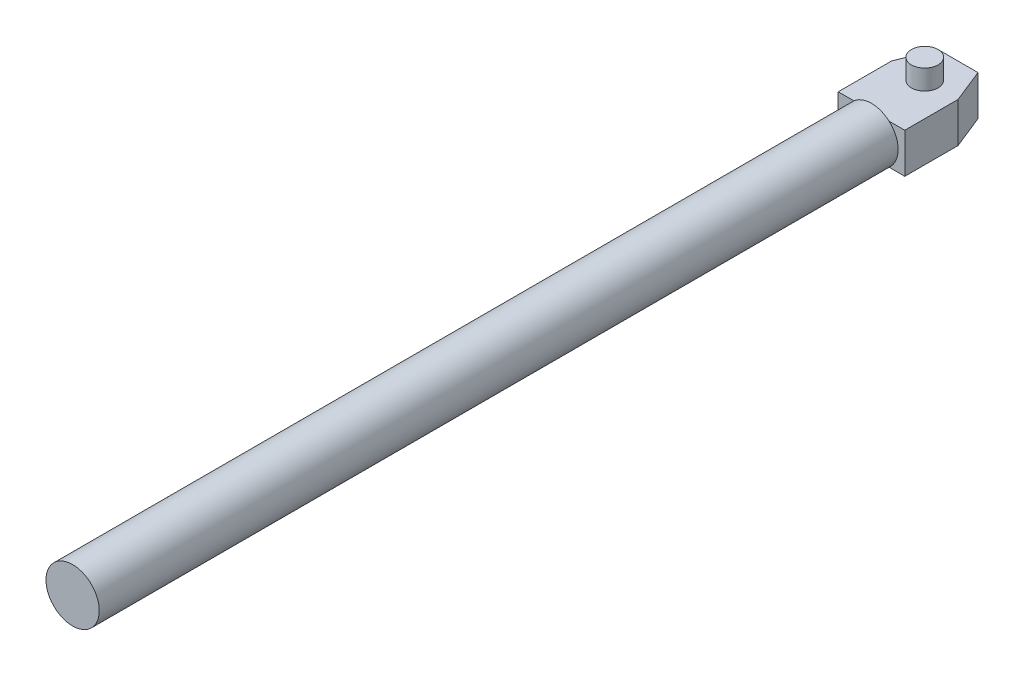
ISO-10303-21;
HEADER;
FILE_DESCRIPTION(('STEP AP214'),'2;1');
FILE_NAME('part.step','',(''),(''),'','','');
FILE_SCHEMA(('AUTOMOTIVE_DESIGN { 1 0 10303 214 1 1 1 1 }'));
ENDSEC;
DATA;
#1=APPLICATION_CONTEXT('core data for automotive mechanical design processes');
#2=APPLICATION_PROTOCOL_DEFINITION('international standard','automotive_design',2000,#1);
#3=PRODUCT_CONTEXT('',#1,'mechanical');
#4=PRODUCT('Part','Part','',(#3));
#5=PRODUCT_RELATED_PRODUCT_CATEGORY('part','',(#4));
#6=PRODUCT_DEFINITION_FORMATION('','',#4);
#7=PRODUCT_DEFINITION_CONTEXT('part definition',#1,'design');
#8=PRODUCT_DEFINITION('design','',#6,#7);
#9=PRODUCT_DEFINITION_SHAPE('','',#8);
#10=(LENGTH_UNIT() NAMED_UNIT(*) SI_UNIT(.MILLI.,.METRE.));
#11=(NAMED_UNIT(*) PLANE_ANGLE_UNIT() SI_UNIT($,.RADIAN.));
#12=(NAMED_UNIT(*) SI_UNIT($,.STERADIAN.) SOLID_ANGLE_UNIT());
#13=UNCERTAINTY_MEASURE_WITH_UNIT(LENGTH_MEASURE(1.E-05),#10,'distance_accuracy_value','');
#14=(GEOMETRIC_REPRESENTATION_CONTEXT(3) GLOBAL_UNCERTAINTY_ASSIGNED_CONTEXT((#13)) GLOBAL_UNIT_ASSIGNED_CONTEXT((#10,
#11,#12)) REPRESENTATION_CONTEXT('',''));
#15=CARTESIAN_POINT('',(0.,0.,0.));
#16=DIRECTION('',(0.,0.,1.));
#17=DIRECTION('',(1.,0.,0.));
#18=AXIS2_PLACEMENT_3D('',#15,#16,#17);
#19=CARTESIAN_POINT('',(-25.,15.,-65.));
#20=DIRECTION('',(0.,-1.,0.));
#21=DIRECTION('',(0.,0.,-1.));
#22=AXIS2_PLACEMENT_3D('',#19,#20,#21);
#23=PLANE('',#22);
#24=DIRECTION('',(0.,0.,1.));
#25=VECTOR('',#24,1.);
#26=CARTESIAN_POINT('',(-25.,15.,0.));
#27=LINE('',#26,#25);
#28=CARTESIAN_POINT('',(-25.,15.,-40.));
#29=VERTEX_POINT('',#28);
#30=CARTESIAN_POINT('',(-25.,15.,0.));
#31=VERTEX_POINT('',#30);
#32=EDGE_CURVE('E116',#29,#31,#27,.T.);
#33=ORIENTED_EDGE('',*,*,#32,.T.);
#34=DIRECTION('',(1.,0.,0.));
#35=VECTOR('',#34,1.);
#36=CARTESIAN_POINT('',(-25.,15.,0.));
#37=LINE('',#36,#35);
#38=CARTESIAN_POINT('',(-13.228756555323,15.,0.));
#39=VERTEX_POINT('',#38);
#40=EDGE_CURVE('E101',#31,#39,#37,.T.);
#41=ORIENTED_EDGE('',*,*,#40,.T.);
#42=CARTESIAN_POINT('',(13.228756555323,15.,0.));
#43=VERTEX_POINT('',#42);
#44=EDGE_CURVE('E114',#39,#43,#37,.T.);
#45=ORIENTED_EDGE('',*,*,#44,.T.);
#46=CARTESIAN_POINT('',(25.,15.,0.));
#47=VERTEX_POINT('',#46);
#48=EDGE_CURVE('E112',#43,#47,#37,.T.);
#49=ORIENTED_EDGE('',*,*,#48,.T.);
#50=DIRECTION('',(0.,0.,-1.));
#51=VECTOR('',#50,1.);
#52=CARTESIAN_POINT('',(25.,15.,0.));
#53=LINE('',#52,#51);
#54=CARTESIAN_POINT('',(25.,15.,-40.));
#55=VERTEX_POINT('',#54);
#56=EDGE_CURVE('E111',#47,#55,#53,.T.);
#57=ORIENTED_EDGE('',*,*,#56,.T.);
#58=DIRECTION('',(-0.371390676354104,0.,-0.928476690885259));
#59=VECTOR('',#58,1.);
#60=CARTESIAN_POINT('',(15.,15.,-65.));
#61=LINE('',#60,#59);
#62=CARTESIAN_POINT('',(15.,15.,-65.));
#63=VERTEX_POINT('',#62);
#64=EDGE_CURVE('E166',#55,#63,#61,.T.);
#65=ORIENTED_EDGE('',*,*,#64,.T.);
#66=DIRECTION('',(-1.,0.,0.));
#67=VECTOR('',#66,1.);
#68=CARTESIAN_POINT('',(-15.,15.,-65.));
#69=LINE('',#68,#67);
#70=CARTESIAN_POINT('',(-15.,15.,-65.));
#71=VERTEX_POINT('',#70);
#72=EDGE_CURVE('E167',#63,#71,#69,.T.);
#73=ORIENTED_EDGE('',*,*,#72,.T.);
#74=DIRECTION('',(-0.371390676354104,0.,0.928476690885259));
#75=VECTOR('',#74,1.);
#76=CARTESIAN_POINT('',(-25.,15.,-40.));
#77=LINE('',#76,#75);
#78=EDGE_CURVE('E119',#71,#29,#77,.T.);
#79=ORIENTED_EDGE('',*,*,#78,.T.);
#80=EDGE_LOOP('',(#33,#41,#45,#49,#57,#65,#73,#79));
#81=FACE_BOUND('',#80,.T.);
#82=CARTESIAN_POINT('',(0.,15.,-40.));
#83=DIRECTION('',(0.,-1.,0.));
#84=DIRECTION('',(0.,0.,-1.));
#85=AXIS2_PLACEMENT_3D('',#82,#83,#84);
#86=CIRCLE('',#85,10.);
#87=CARTESIAN_POINT('',(0.,15.,-50.));
#88=VERTEX_POINT('',#87);
#89=EDGE_CURVE('E11',#88,#88,#86,.F.);
#90=ORIENTED_EDGE('',*,*,#89,.F.);
#91=EDGE_LOOP('',(#90));
#92=FACE_BOUND('',#91,.T.);
#93=ADVANCED_FACE('F36',(#81,#92),#23,.F.);
#94=CARTESIAN_POINT('',(-25.,-15.,-65.));
#95=DIRECTION('',(0.,-1.,0.));
#96=DIRECTION('',(0.,0.,-1.));
#97=AXIS2_PLACEMENT_3D('',#94,#95,#96);
#98=PLANE('',#97);
#99=DIRECTION('',(0.,0.,1.));
#100=VECTOR('',#99,1.);
#101=CARTESIAN_POINT('',(-25.,-15.,0.));
#102=LINE('',#101,#100);
#103=CARTESIAN_POINT('',(-25.,-15.,-40.));
#104=VERTEX_POINT('',#103);
#105=CARTESIAN_POINT('',(-25.,-15.,0.));
#106=VERTEX_POINT('',#105);
#107=EDGE_CURVE('E127',#104,#106,#102,.T.);
#108=ORIENTED_EDGE('',*,*,#107,.F.);
#109=DIRECTION('',(-0.371390676354104,0.,0.928476690885259));
#110=VECTOR('',#109,1.);
#111=CARTESIAN_POINT('',(-25.,-15.,-40.));
#112=LINE('',#111,#110);
#113=CARTESIAN_POINT('',(-15.,-15.,-65.));
#114=VERTEX_POINT('',#113);
#115=EDGE_CURVE('E123',#114,#104,#112,.T.);
#116=ORIENTED_EDGE('',*,*,#115,.F.);
#117=DIRECTION('',(-1.,0.,0.));
#118=VECTOR('',#117,1.);
#119=CARTESIAN_POINT('',(-15.,-15.,-65.));
#120=LINE('',#119,#118);
#121=CARTESIAN_POINT('',(15.,-15.,-65.));
#122=VERTEX_POINT('',#121);
#123=EDGE_CURVE('E187',#122,#114,#120,.T.);
#124=ORIENTED_EDGE('',*,*,#123,.F.);
#125=DIRECTION('',(-0.371390676354104,0.,-0.928476690885259));
#126=VECTOR('',#125,1.);
#127=CARTESIAN_POINT('',(15.,-15.,-65.));
#128=LINE('',#127,#126);
#129=CARTESIAN_POINT('',(25.,-15.,-40.));
#130=VERTEX_POINT('',#129);
#131=EDGE_CURVE('E184',#130,#122,#128,.T.);
#132=ORIENTED_EDGE('',*,*,#131,.F.);
#133=DIRECTION('',(0.,0.,-1.));
#134=VECTOR('',#133,1.);
#135=CARTESIAN_POINT('',(25.,-15.,0.));
#136=LINE('',#135,#134);
#137=CARTESIAN_POINT('',(25.,-15.,0.));
#138=VERTEX_POINT('',#137);
#139=EDGE_CURVE('E154',#138,#130,#136,.T.);
#140=ORIENTED_EDGE('',*,*,#139,.F.);
#141=DIRECTION('',(1.,0.,0.));
#142=VECTOR('',#141,1.);
#143=CARTESIAN_POINT('',(-25.,-15.,0.));
#144=LINE('',#143,#142);
#145=CARTESIAN_POINT('',(13.228756555323,-15.,0.));
#146=VERTEX_POINT('',#145);
#147=EDGE_CURVE('E148',#146,#138,#144,.T.);
#148=ORIENTED_EDGE('',*,*,#147,.F.);
#149=CARTESIAN_POINT('',(-13.228756555323,-15.,0.));
#150=VERTEX_POINT('',#149);
#151=EDGE_CURVE('E45',#150,#146,#144,.T.);
#152=ORIENTED_EDGE('',*,*,#151,.F.);
#153=EDGE_CURVE('E155',#106,#150,#144,.T.);
#154=ORIENTED_EDGE('',*,*,#153,.F.);
#155=EDGE_LOOP('',(#108,#116,#124,#132,#140,#148,#152,#154));
#156=FACE_BOUND('',#155,.T.);
#157=CARTESIAN_POINT('',(0.,-15.,-40.));
#158=DIRECTION('',(0.,-1.,0.));
#159=DIRECTION('',(0.,0.,-1.));
#160=AXIS2_PLACEMENT_3D('',#157,#158,#159);
#161=CIRCLE('',#160,10.);
#162=CARTESIAN_POINT('',(0.,-15.,-50.));
#163=VERTEX_POINT('',#162);
#164=EDGE_CURVE('E40',#163,#163,#161,.F.);
#165=ORIENTED_EDGE('',*,*,#164,.T.);
#166=EDGE_LOOP('',(#165));
#167=FACE_BOUND('',#166,.T.);
#168=ADVANCED_FACE('F151',(#156,#167),#98,.T.);
#169=CARTESIAN_POINT('',(0.,0.,0.));
#170=DIRECTION('',(0.,0.,1.));
#171=DIRECTION('',(1.,0.,0.));
#172=AXIS2_PLACEMENT_3D('',#169,#170,#171);
#173=PLANE('',#172);
#174=ORIENTED_EDGE('',*,*,#44,.F.);
#175=CARTESIAN_POINT('',(0.,0.,0.));
#176=DIRECTION('',(0.,0.,1.));
#177=DIRECTION('',(1.,0.,0.));
#178=AXIS2_PLACEMENT_3D('',#175,#176,#177);
#179=CIRCLE('',#178,20.);
#180=EDGE_CURVE('E132',#43,#39,#179,.T.);
#181=ORIENTED_EDGE('',*,*,#180,.F.);
#182=EDGE_LOOP('',(#174,#181));
#183=FACE_BOUND('',#182,.T.);
#184=ADVANCED_FACE('F209',(#183),#173,.F.);
#185=CARTESIAN_POINT('',(0.,0.,600.));
#186=DIRECTION('',(0.,0.,-1.));
#187=DIRECTION('',(-1.,0.,0.));
#188=AXIS2_PLACEMENT_3D('',#185,#186,#187);
#189=CYLINDRICAL_SURFACE('',#188,20.);
#190=CARTESIAN_POINT('',(0.,0.,600.));
#191=DIRECTION('',(0.,0.,1.));
#192=DIRECTION('',(1.,0.,0.));
#193=AXIS2_PLACEMENT_3D('',#190,#191,#192);
#194=CIRCLE('',#193,20.);
#195=CARTESIAN_POINT('',(20.,0.,600.));
#196=VERTEX_POINT('',#195);
#197=EDGE_CURVE('E138',#196,#196,#194,.T.);
#198=ORIENTED_EDGE('',*,*,#197,.F.);
#199=EDGE_LOOP('',(#198));
#200=FACE_BOUND('',#199,.T.);
#201=ORIENTED_EDGE('',*,*,#180,.T.);
#202=EDGE_CURVE('E108',#39,#150,#179,.T.);
#203=ORIENTED_EDGE('',*,*,#202,.T.);
#204=EDGE_CURVE('E54',#150,#146,#179,.T.);
#205=ORIENTED_EDGE('',*,*,#204,.T.);
#206=EDGE_CURVE('E128',#146,#43,#179,.T.);
#207=ORIENTED_EDGE('',*,*,#206,.T.);
#208=EDGE_LOOP('',(#201,#203,#205,#207));
#209=FACE_BOUND('',#208,.T.);
#210=ADVANCED_FACE('F38',(#200,#209),#189,.T.);
#211=CARTESIAN_POINT('',(0.,0.,600.));
#212=DIRECTION('',(0.,0.,1.));
#213=DIRECTION('',(1.,0.,0.));
#214=AXIS2_PLACEMENT_3D('',#211,#212,#213);
#215=PLANE('',#214);
#216=ORIENTED_EDGE('',*,*,#197,.T.);
#217=EDGE_LOOP('',(#216));
#218=FACE_BOUND('',#217,.T.);
#219=ADVANCED_FACE('F284',(#218),#215,.T.);
#220=ORIENTED_EDGE('',*,*,#204,.F.);
#221=ORIENTED_EDGE('',*,*,#151,.T.);
#222=EDGE_LOOP('',(#220,#221));
#223=FACE_BOUND('',#222,.T.);
#224=ADVANCED_FACE('F276',(#223),#173,.F.);
#225=CARTESIAN_POINT('',(-25.,15.,0.));
#226=DIRECTION('',(0.,0.,-1.));
#227=DIRECTION('',(-1.,0.,0.));
#228=AXIS2_PLACEMENT_3D('',#225,#226,#227);
#229=PLANE('',#228);
#230=ORIENTED_EDGE('',*,*,#202,.F.);
#231=ORIENTED_EDGE('',*,*,#40,.F.);
#232=DIRECTION('',(0.,-1.,0.));
#233=VECTOR('',#232,1.);
#234=CARTESIAN_POINT('',(-25.,15.,0.));
#235=LINE('',#234,#233);
#236=EDGE_CURVE('E106',#31,#106,#235,.T.);
#237=ORIENTED_EDGE('',*,*,#236,.T.);
#238=ORIENTED_EDGE('',*,*,#153,.T.);
#239=EDGE_LOOP('',(#230,#231,#237,#238));
#240=FACE_BOUND('',#239,.T.);
#241=ADVANCED_FACE('F103',(#240),#229,.F.);
#242=CARTESIAN_POINT('',(-25.,15.,0.));
#243=DIRECTION('',(1.,0.,0.));
#244=DIRECTION('',(0.,0.,-1.));
#245=AXIS2_PLACEMENT_3D('',#242,#243,#244);
#246=PLANE('',#245);
#247=ORIENTED_EDGE('',*,*,#107,.T.);
#248=ORIENTED_EDGE('',*,*,#236,.F.);
#249=ORIENTED_EDGE('',*,*,#32,.F.);
#250=DIRECTION('',(0.,-1.,0.));
#251=VECTOR('',#250,1.);
#252=CARTESIAN_POINT('',(-25.,15.,-40.));
#253=LINE('',#252,#251);
#254=EDGE_CURVE('E171',#29,#104,#253,.T.);
#255=ORIENTED_EDGE('',*,*,#254,.T.);
#256=EDGE_LOOP('',(#247,#248,#249,#255));
#257=FACE_BOUND('',#256,.T.);
#258=ADVANCED_FACE('F125',(#257),#246,.F.);
#259=ORIENTED_EDGE('',*,*,#206,.F.);
#260=ORIENTED_EDGE('',*,*,#147,.T.);
#261=DIRECTION('',(0.,-1.,0.));
#262=VECTOR('',#261,1.);
#263=CARTESIAN_POINT('',(25.,15.,0.));
#264=LINE('',#263,#262);
#265=EDGE_CURVE('E129',#47,#138,#264,.T.);
#266=ORIENTED_EDGE('',*,*,#265,.F.);
#267=ORIENTED_EDGE('',*,*,#48,.F.);
#268=EDGE_LOOP('',(#259,#260,#266,#267));
#269=FACE_BOUND('',#268,.T.);
#270=ADVANCED_FACE('F146',(#269),#229,.F.);
#271=CARTESIAN_POINT('',(25.,15.,0.));
#272=DIRECTION('',(-1.,0.,0.));
#273=DIRECTION('',(0.,0.,1.));
#274=AXIS2_PLACEMENT_3D('',#271,#272,#273);
#275=PLANE('',#274);
#276=ORIENTED_EDGE('',*,*,#139,.T.);
#277=DIRECTION('',(0.,-1.,0.));
#278=VECTOR('',#277,1.);
#279=CARTESIAN_POINT('',(25.,15.,-40.));
#280=LINE('',#279,#278);
#281=EDGE_CURVE('E134',#55,#130,#280,.T.);
#282=ORIENTED_EDGE('',*,*,#281,.F.);
#283=ORIENTED_EDGE('',*,*,#56,.F.);
#284=ORIENTED_EDGE('',*,*,#265,.T.);
#285=EDGE_LOOP('',(#276,#282,#283,#284));
#286=FACE_BOUND('',#285,.T.);
#287=ADVANCED_FACE('F163',(#286),#275,.F.);
#288=CARTESIAN_POINT('',(15.,15.,-65.));
#289=DIRECTION('',(-0.928476690885259,0.,0.371390676354104));
#290=DIRECTION('',(0.371390676354104,0.,0.928476690885259));
#291=AXIS2_PLACEMENT_3D('',#288,#289,#290);
#292=PLANE('',#291);
#293=ORIENTED_EDGE('',*,*,#131,.T.);
#294=DIRECTION('',(0.,-1.,0.));
#295=VECTOR('',#294,1.);
#296=CARTESIAN_POINT('',(15.,15.,-65.));
#297=LINE('',#296,#295);
#298=EDGE_CURVE('E175',#63,#122,#297,.T.);
#299=ORIENTED_EDGE('',*,*,#298,.F.);
#300=ORIENTED_EDGE('',*,*,#64,.F.);
#301=ORIENTED_EDGE('',*,*,#281,.T.);
#302=EDGE_LOOP('',(#293,#299,#300,#301));
#303=FACE_BOUND('',#302,.T.);
#304=ADVANCED_FACE('F182',(#303),#292,.F.);
#305=CARTESIAN_POINT('',(-15.,15.,-65.));
#306=DIRECTION('',(0.,0.,1.));
#307=DIRECTION('',(1.,0.,0.));
#308=AXIS2_PLACEMENT_3D('',#305,#306,#307);
#309=PLANE('',#308);
#310=ORIENTED_EDGE('',*,*,#123,.T.);
#311=DIRECTION('',(0.,-1.,0.));
#312=VECTOR('',#311,1.);
#313=CARTESIAN_POINT('',(-15.,15.,-65.));
#314=LINE('',#313,#312);
#315=EDGE_CURVE('E172',#71,#114,#314,.T.);
#316=ORIENTED_EDGE('',*,*,#315,.F.);
#317=ORIENTED_EDGE('',*,*,#72,.F.);
#318=ORIENTED_EDGE('',*,*,#298,.T.);
#319=EDGE_LOOP('',(#310,#316,#317,#318));
#320=FACE_BOUND('',#319,.T.);
#321=ADVANCED_FACE('F194',(#320),#309,.F.);
#322=CARTESIAN_POINT('',(-25.,15.,-40.));
#323=DIRECTION('',(0.928476690885259,0.,0.371390676354104));
#324=DIRECTION('',(0.371390676354104,0.,-0.928476690885259));
#325=AXIS2_PLACEMENT_3D('',#322,#323,#324);
#326=PLANE('',#325);
#327=ORIENTED_EDGE('',*,*,#115,.T.);
#328=ORIENTED_EDGE('',*,*,#254,.F.);
#329=ORIENTED_EDGE('',*,*,#78,.F.);
#330=ORIENTED_EDGE('',*,*,#315,.T.);
#331=EDGE_LOOP('',(#327,#328,#329,#330));
#332=FACE_BOUND('',#331,.T.);
#333=ADVANCED_FACE('F192',(#332),#326,.F.);
#334=CARTESIAN_POINT('',(0.,-30.,-40.));
#335=DIRECTION('',(0.,1.,0.));
#336=DIRECTION('',(0.,0.,1.));
#337=AXIS2_PLACEMENT_3D('',#334,#335,#336);
#338=PLANE('',#337);
#339=CARTESIAN_POINT('',(0.,-30.,-40.));
#340=DIRECTION('',(0.,1.,0.));
#341=DIRECTION('',(0.,0.,1.));
#342=AXIS2_PLACEMENT_3D('',#339,#340,#341);
#343=CIRCLE('',#342,10.);
#344=CARTESIAN_POINT('',(0.,-30.,-30.));
#345=VERTEX_POINT('',#344);
#346=EDGE_CURVE('E230',#345,#345,#343,.T.);
#347=ORIENTED_EDGE('',*,*,#346,.F.);
#348=EDGE_LOOP('',(#347));
#349=FACE_BOUND('',#348,.T.);
#350=ADVANCED_FACE('F201',(#349),#338,.F.);
#351=CARTESIAN_POINT('',(0.,30.,-40.));
#352=DIRECTION('',(0.,-1.,0.));
#353=DIRECTION('',(0.,0.,-1.));
#354=AXIS2_PLACEMENT_3D('',#351,#352,#353);
#355=CYLINDRICAL_SURFACE('',#354,10.);
#356=ORIENTED_EDGE('',*,*,#164,.F.);
#357=EDGE_LOOP('',(#356));
#358=FACE_BOUND('',#357,.T.);
#359=ORIENTED_EDGE('',*,*,#346,.T.);
#360=EDGE_LOOP('',(#359));
#361=FACE_BOUND('',#360,.T.);
#362=ADVANCED_FACE('F212',(#358,#361),#355,.T.);
#363=CARTESIAN_POINT('',(0.,30.,-40.));
#364=DIRECTION('',(0.,1.,0.));
#365=DIRECTION('',(0.,0.,1.));
#366=AXIS2_PLACEMENT_3D('',#363,#364,#365);
#367=CIRCLE('',#366,10.);
#368=CARTESIAN_POINT('',(0.,30.,-30.));
#369=VERTEX_POINT('',#368);
#370=EDGE_CURVE('E229',#369,#369,#367,.T.);
#371=ORIENTED_EDGE('',*,*,#370,.F.);
#372=EDGE_LOOP('',(#371));
#373=FACE_BOUND('',#372,.T.);
#374=ORIENTED_EDGE('',*,*,#89,.T.);
#375=EDGE_LOOP('',(#374));
#376=FACE_BOUND('',#375,.T.);
#377=ADVANCED_FACE('F215',(#373,#376),#355,.T.);
#378=CARTESIAN_POINT('',(0.,30.,-40.));
#379=DIRECTION('',(0.,1.,0.));
#380=DIRECTION('',(0.,0.,1.));
#381=AXIS2_PLACEMENT_3D('',#378,#379,#380);
#382=PLANE('',#381);
#383=ORIENTED_EDGE('',*,*,#370,.T.);
#384=EDGE_LOOP('',(#383));
#385=FACE_BOUND('',#384,.T.);
#386=ADVANCED_FACE('F220',(#385),#382,.T.);
#387=CLOSED_SHELL('',(#93,#168,#184,#210,#219,#224,#241,#258,#270,#287,#304,#321,#333,#350,#362,
#377,#386));
#388=MANIFOLD_SOLID_BREP('B2',#387);
#389=ADVANCED_BREP_SHAPE_REPRESENTATION('',(#18,#388),#14);
#390=SHAPE_DEFINITION_REPRESENTATION(#9,#389);
ENDSEC;
END-ISO-10303-21;
